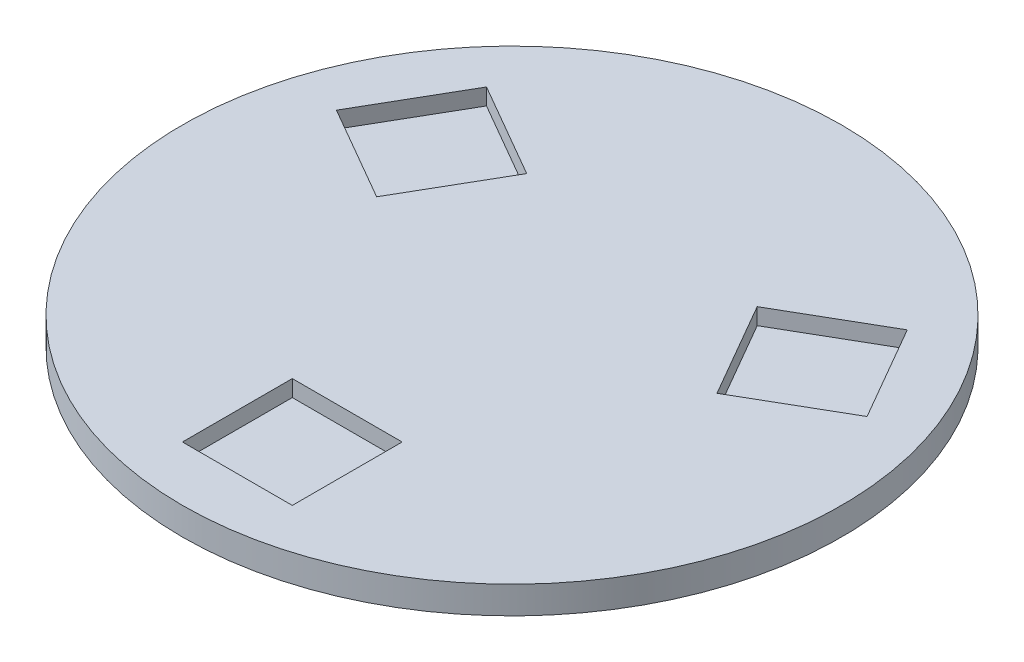
ISO-10303-21;
HEADER;
FILE_DESCRIPTION(('STEP AP214'),'2;1');
FILE_NAME('part.step','',(''),(''),'','','');
FILE_SCHEMA(('AUTOMOTIVE_DESIGN { 1 0 10303 214 1 1 1 1 }'));
ENDSEC;
DATA;
#1=APPLICATION_CONTEXT('core data for automotive mechanical design processes');
#2=APPLICATION_PROTOCOL_DEFINITION('international standard','automotive_design',2000,#1);
#3=PRODUCT_CONTEXT('',#1,'mechanical');
#4=PRODUCT('Part','Part','',(#3));
#5=PRODUCT_RELATED_PRODUCT_CATEGORY('part','',(#4));
#6=PRODUCT_DEFINITION_FORMATION('','',#4);
#7=PRODUCT_DEFINITION_CONTEXT('part definition',#1,'design');
#8=PRODUCT_DEFINITION('design','',#6,#7);
#9=PRODUCT_DEFINITION_SHAPE('','',#8);
#10=(LENGTH_UNIT() NAMED_UNIT(*) SI_UNIT(.MILLI.,.METRE.));
#11=(NAMED_UNIT(*) PLANE_ANGLE_UNIT() SI_UNIT($,.RADIAN.));
#12=(NAMED_UNIT(*) SI_UNIT($,.STERADIAN.) SOLID_ANGLE_UNIT());
#13=UNCERTAINTY_MEASURE_WITH_UNIT(LENGTH_MEASURE(1.E-05),#10,'distance_accuracy_value','');
#14=(GEOMETRIC_REPRESENTATION_CONTEXT(3) GLOBAL_UNCERTAINTY_ASSIGNED_CONTEXT((#13)) GLOBAL_UNIT_ASSIGNED_CONTEXT((#10,
#11,#12)) REPRESENTATION_CONTEXT('',''));
#15=CARTESIAN_POINT('',(0.,0.,0.));
#16=DIRECTION('',(0.,0.,1.));
#17=DIRECTION('',(1.,0.,0.));
#18=AXIS2_PLACEMENT_3D('',#15,#16,#17);
#19=CARTESIAN_POINT('',(0.,250.,0.));
#20=DIRECTION('',(0.,-1.,0.));
#21=DIRECTION('',(0.,0.,-1.));
#22=AXIS2_PLACEMENT_3D('',#19,#20,#21);
#23=CYLINDRICAL_SURFACE('',#22,3000.);
#24=CARTESIAN_POINT('',(0.,250.,0.));
#25=DIRECTION('',(0.,1.,0.));
#26=DIRECTION('',(0.,0.,1.));
#27=AXIS2_PLACEMENT_3D('',#24,#25,#26);
#28=CIRCLE('',#27,3000.);
#29=CARTESIAN_POINT('',(0.,250.,3000.));
#30=VERTEX_POINT('',#29);
#31=EDGE_CURVE('E11',#30,#30,#28,.T.);
#32=ORIENTED_EDGE('',*,*,#31,.F.);
#33=EDGE_LOOP('',(#32));
#34=FACE_BOUND('',#33,.T.);
#35=CARTESIAN_POINT('',(0.,0.,0.));
#36=DIRECTION('',(0.,1.,0.));
#37=DIRECTION('',(0.,0.,1.));
#38=AXIS2_PLACEMENT_3D('',#35,#36,#37);
#39=CIRCLE('',#38,3000.);
#40=CARTESIAN_POINT('',(0.,0.,3000.));
#41=VERTEX_POINT('',#40);
#42=EDGE_CURVE('E47',#41,#41,#39,.T.);
#43=ORIENTED_EDGE('',*,*,#42,.T.);
#44=EDGE_LOOP('',(#43));
#45=FACE_BOUND('',#44,.T.);
#46=ADVANCED_FACE('F44',(#34,#45),#23,.T.);
#47=CARTESIAN_POINT('',(0.,250.,0.));
#48=DIRECTION('',(0.,1.,0.));
#49=DIRECTION('',(0.,0.,1.));
#50=AXIS2_PLACEMENT_3D('',#47,#48,#49);
#51=PLANE('',#50);
#52=DIRECTION('',(0.866025403784436,0.,-0.500000000000004));
#53=VECTOR('',#52,1.);
#54=CARTESIAN_POINT('',(1549.03810567666,250.,-316.987298107788));
#55=LINE('',#54,#53);
#56=CARTESIAN_POINT('',(1549.03810567666,250.,-316.987298107788));
#57=VERTEX_POINT('',#56);
#58=CARTESIAN_POINT('',(2415.06350946109,250.,-816.987298107792));
#59=VERTEX_POINT('',#58);
#60=EDGE_CURVE('E59',#57,#59,#55,.T.);
#61=ORIENTED_EDGE('',*,*,#60,.F.);
#62=DIRECTION('',(0.500000000000004,0.,0.866025403784436));
#63=VECTOR('',#62,1.);
#64=CARTESIAN_POINT('',(1049.03810567665,250.,-1183.01270189222));
#65=LINE('',#64,#63);
#66=CARTESIAN_POINT('',(1049.03810567665,250.,-1183.01270189222));
#67=VERTEX_POINT('',#66);
#68=EDGE_CURVE('E156',#67,#57,#65,.T.);
#69=ORIENTED_EDGE('',*,*,#68,.F.);
#70=DIRECTION('',(-0.866025403784436,0.,0.500000000000004));
#71=VECTOR('',#70,1.);
#72=CARTESIAN_POINT('',(1049.03810567665,250.,-1183.01270189222));
#73=LINE('',#72,#71);
#74=CARTESIAN_POINT('',(1915.06350946109,250.,-1683.01270189223));
#75=VERTEX_POINT('',#74);
#76=EDGE_CURVE('E160',#75,#67,#73,.T.);
#77=ORIENTED_EDGE('',*,*,#76,.F.);
#78=DIRECTION('',(-0.500000000000004,0.,-0.866025403784436));
#79=VECTOR('',#78,1.);
#80=CARTESIAN_POINT('',(1915.06350946109,250.,-1683.01270189223));
#81=LINE('',#80,#79);
#82=EDGE_CURVE('E169',#59,#75,#81,.T.);
#83=ORIENTED_EDGE('',*,*,#82,.F.);
#84=EDGE_LOOP('',(#61,#69,#77,#83));
#85=FACE_BOUND('',#84,.T.);
#86=DIRECTION('',(-0.866025403784443,0.,-0.499999999999992));
#87=VECTOR('',#86,1.);
#88=CARTESIAN_POINT('',(-1049.03810567667,250.,-1183.01270189221));
#89=LINE('',#88,#87);
#90=CARTESIAN_POINT('',(-1049.03810567667,250.,-1183.01270189221));
#91=VERTEX_POINT('',#90);
#92=CARTESIAN_POINT('',(-1915.06350946111,250.,-1683.0127018922));
#93=VERTEX_POINT('',#92);
#94=EDGE_CURVE('E67',#91,#93,#89,.T.);
#95=ORIENTED_EDGE('',*,*,#94,.F.);
#96=DIRECTION('',(0.499999999999992,0.,-0.866025403784443));
#97=VECTOR('',#96,1.);
#98=CARTESIAN_POINT('',(-1549.03810567666,250.,-316.987298107766));
#99=LINE('',#98,#97);
#100=CARTESIAN_POINT('',(-1549.03810567666,250.,-316.987298107766));
#101=VERTEX_POINT('',#100);
#102=EDGE_CURVE('E190',#101,#91,#99,.T.);
#103=ORIENTED_EDGE('',*,*,#102,.F.);
#104=DIRECTION('',(0.866025403784443,0.,0.499999999999992));
#105=VECTOR('',#104,1.);
#106=CARTESIAN_POINT('',(-1549.03810567666,250.,-316.987298107766));
#107=LINE('',#106,#105);
#108=CARTESIAN_POINT('',(-2415.0635094611,250.,-816.987298107758));
#109=VERTEX_POINT('',#108);
#110=EDGE_CURVE('E209',#109,#101,#107,.T.);
#111=ORIENTED_EDGE('',*,*,#110,.F.);
#112=DIRECTION('',(-0.499999999999992,0.,0.866025403784443));
#113=VECTOR('',#112,1.);
#114=CARTESIAN_POINT('',(-2415.0635094611,250.,-816.987298107758));
#115=LINE('',#114,#113);
#116=EDGE_CURVE('E205',#93,#109,#115,.T.);
#117=ORIENTED_EDGE('',*,*,#116,.F.);
#118=EDGE_LOOP('',(#95,#103,#111,#117));
#119=FACE_BOUND('',#118,.T.);
#120=DIRECTION('',(0.,0.,1.));
#121=VECTOR('',#120,1.);
#122=CARTESIAN_POINT('',(-500.,250.,1500.));
#123=LINE('',#122,#121);
#124=CARTESIAN_POINT('',(-500.,250.,1500.));
#125=VERTEX_POINT('',#124);
#126=CARTESIAN_POINT('',(-499.999999999999,250.,2500.));
#127=VERTEX_POINT('',#126);
#128=EDGE_CURVE('E179',#125,#127,#123,.T.);
#129=ORIENTED_EDGE('',*,*,#128,.F.);
#130=DIRECTION('',(-1.,0.,0.));
#131=VECTOR('',#130,1.);
#132=CARTESIAN_POINT('',(500.,250.,1500.));
#133=LINE('',#132,#131);
#134=CARTESIAN_POINT('',(500.,250.,1500.));
#135=VERTEX_POINT('',#134);
#136=EDGE_CURVE('E231',#135,#125,#133,.T.);
#137=ORIENTED_EDGE('',*,*,#136,.F.);
#138=DIRECTION('',(0.,0.,-1.));
#139=VECTOR('',#138,1.);
#140=CARTESIAN_POINT('',(500.,250.,1500.));
#141=LINE('',#140,#139);
#142=CARTESIAN_POINT('',(500.,250.,2500.));
#143=VERTEX_POINT('',#142);
#144=EDGE_CURVE('E250',#143,#135,#141,.T.);
#145=ORIENTED_EDGE('',*,*,#144,.F.);
#146=DIRECTION('',(1.,0.,0.));
#147=VECTOR('',#146,1.);
#148=CARTESIAN_POINT('',(500.,250.,2500.));
#149=LINE('',#148,#147);
#150=EDGE_CURVE('E246',#127,#143,#149,.T.);
#151=ORIENTED_EDGE('',*,*,#150,.F.);
#152=EDGE_LOOP('',(#129,#137,#145,#151));
#153=FACE_BOUND('',#152,.T.);
#154=ORIENTED_EDGE('',*,*,#31,.T.);
#155=EDGE_LOOP('',(#154));
#156=FACE_BOUND('',#155,.T.);
#157=ADVANCED_FACE('F277',(#85,#119,#153,#156),#51,.T.);
#158=CARTESIAN_POINT('',(0.,0.,0.));
#159=DIRECTION('',(0.,1.,0.));
#160=DIRECTION('',(0.,0.,1.));
#161=AXIS2_PLACEMENT_3D('',#158,#159,#160);
#162=PLANE('',#161);
#163=ORIENTED_EDGE('',*,*,#42,.F.);
#164=EDGE_LOOP('',(#163));
#165=FACE_BOUND('',#164,.T.);
#166=ADVANCED_FACE('F296',(#165),#162,.F.);
#167=CARTESIAN_POINT('',(-500.,100.,1500.));
#168=DIRECTION('',(-1.,0.,0.));
#169=DIRECTION('',(0.,0.,1.));
#170=AXIS2_PLACEMENT_3D('',#167,#168,#169);
#171=PLANE('',#170);
#172=ORIENTED_EDGE('',*,*,#128,.T.);
#173=DIRECTION('',(0.,1.,0.));
#174=VECTOR('',#173,1.);
#175=CARTESIAN_POINT('',(-499.999999999999,100.,2500.));
#176=LINE('',#175,#174);
#177=CARTESIAN_POINT('',(-499.999999999999,100.,2500.));
#178=VERTEX_POINT('',#177);
#179=EDGE_CURVE('E243',#178,#127,#176,.T.);
#180=ORIENTED_EDGE('',*,*,#179,.F.);
#181=DIRECTION('',(0.,0.,1.));
#182=VECTOR('',#181,1.);
#183=CARTESIAN_POINT('',(-500.,100.,1500.));
#184=LINE('',#183,#182);
#185=CARTESIAN_POINT('',(-500.,100.,1500.));
#186=VERTEX_POINT('',#185);
#187=EDGE_CURVE('E226',#186,#178,#184,.T.);
#188=ORIENTED_EDGE('',*,*,#187,.F.);
#189=DIRECTION('',(0.,1.,0.));
#190=VECTOR('',#189,1.);
#191=CARTESIAN_POINT('',(-500.,100.,1500.));
#192=LINE('',#191,#190);
#193=EDGE_CURVE('E257',#186,#125,#192,.T.);
#194=ORIENTED_EDGE('',*,*,#193,.T.);
#195=EDGE_LOOP('',(#172,#180,#188,#194));
#196=FACE_BOUND('',#195,.T.);
#197=ADVANCED_FACE('F286',(#196),#171,.F.);
#198=CARTESIAN_POINT('',(500.,100.,1500.));
#199=DIRECTION('',(0.,0.,-1.));
#200=DIRECTION('',(-1.,0.,0.));
#201=AXIS2_PLACEMENT_3D('',#198,#199,#200);
#202=PLANE('',#201);
#203=ORIENTED_EDGE('',*,*,#136,.T.);
#204=ORIENTED_EDGE('',*,*,#193,.F.);
#205=DIRECTION('',(-1.,0.,0.));
#206=VECTOR('',#205,1.);
#207=CARTESIAN_POINT('',(500.,100.,1500.));
#208=LINE('',#207,#206);
#209=CARTESIAN_POINT('',(500.,100.,1500.));
#210=VERTEX_POINT('',#209);
#211=EDGE_CURVE('E239',#210,#186,#208,.T.);
#212=ORIENTED_EDGE('',*,*,#211,.F.);
#213=DIRECTION('',(0.,1.,0.));
#214=VECTOR('',#213,1.);
#215=CARTESIAN_POINT('',(500.,100.,1500.));
#216=LINE('',#215,#214);
#217=EDGE_CURVE('E260',#210,#135,#216,.T.);
#218=ORIENTED_EDGE('',*,*,#217,.T.);
#219=EDGE_LOOP('',(#203,#204,#212,#218));
#220=FACE_BOUND('',#219,.T.);
#221=ADVANCED_FACE('F288',(#220),#202,.F.);
#222=CARTESIAN_POINT('',(500.,100.,1500.));
#223=DIRECTION('',(1.,0.,0.));
#224=DIRECTION('',(0.,0.,-1.));
#225=AXIS2_PLACEMENT_3D('',#222,#223,#224);
#226=PLANE('',#225);
#227=ORIENTED_EDGE('',*,*,#144,.T.);
#228=ORIENTED_EDGE('',*,*,#217,.F.);
#229=DIRECTION('',(0.,0.,-1.));
#230=VECTOR('',#229,1.);
#231=CARTESIAN_POINT('',(500.,100.,1500.));
#232=LINE('',#231,#230);
#233=CARTESIAN_POINT('',(500.,100.,2500.));
#234=VERTEX_POINT('',#233);
#235=EDGE_CURVE('E235',#234,#210,#232,.T.);
#236=ORIENTED_EDGE('',*,*,#235,.F.);
#237=DIRECTION('',(0.,1.,0.));
#238=VECTOR('',#237,1.);
#239=CARTESIAN_POINT('',(500.,100.,2500.));
#240=LINE('',#239,#238);
#241=EDGE_CURVE('E263',#234,#143,#240,.T.);
#242=ORIENTED_EDGE('',*,*,#241,.T.);
#243=EDGE_LOOP('',(#227,#228,#236,#242));
#244=FACE_BOUND('',#243,.T.);
#245=ADVANCED_FACE('F281',(#244),#226,.F.);
#246=CARTESIAN_POINT('',(500.,100.,2500.));
#247=DIRECTION('',(0.,0.,1.));
#248=DIRECTION('',(1.,0.,0.));
#249=AXIS2_PLACEMENT_3D('',#246,#247,#248);
#250=PLANE('',#249);
#251=ORIENTED_EDGE('',*,*,#150,.T.);
#252=ORIENTED_EDGE('',*,*,#241,.F.);
#253=DIRECTION('',(1.,0.,0.));
#254=VECTOR('',#253,1.);
#255=CARTESIAN_POINT('',(500.,100.,2500.));
#256=LINE('',#255,#254);
#257=EDGE_CURVE('E230',#178,#234,#256,.T.);
#258=ORIENTED_EDGE('',*,*,#257,.F.);
#259=ORIENTED_EDGE('',*,*,#179,.T.);
#260=EDGE_LOOP('',(#251,#252,#258,#259));
#261=FACE_BOUND('',#260,.T.);
#262=ADVANCED_FACE('F271',(#261),#250,.F.);
#263=CARTESIAN_POINT('',(0.,100.,0.));
#264=DIRECTION('',(0.,-1.,0.));
#265=DIRECTION('',(0.,0.,-1.));
#266=AXIS2_PLACEMENT_3D('',#263,#264,#265);
#267=PLANE('',#266);
#268=ORIENTED_EDGE('',*,*,#187,.T.);
#269=ORIENTED_EDGE('',*,*,#257,.T.);
#270=ORIENTED_EDGE('',*,*,#235,.T.);
#271=ORIENTED_EDGE('',*,*,#211,.T.);
#272=EDGE_LOOP('',(#268,#269,#270,#271));
#273=FACE_BOUND('',#272,.T.);
#274=ADVANCED_FACE('F285',(#273),#267,.F.);
#275=CARTESIAN_POINT('',(-1049.03810567667,100.,-1183.01270189221));
#276=DIRECTION('',(0.499999999999992,0.,-0.866025403784443));
#277=DIRECTION('',(-0.866025403784443,0.,-0.499999999999992));
#278=AXIS2_PLACEMENT_3D('',#275,#276,#277);
#279=PLANE('',#278);
#280=ORIENTED_EDGE('',*,*,#94,.T.);
#281=DIRECTION('',(0.,1.,0.));
#282=VECTOR('',#281,1.);
#283=CARTESIAN_POINT('',(-1915.06350946111,100.,-1683.0127018922));
#284=LINE('',#283,#282);
#285=CARTESIAN_POINT('',(-1915.06350946111,100.,-1683.0127018922));
#286=VERTEX_POINT('',#285);
#287=EDGE_CURVE('E202',#286,#93,#284,.T.);
#288=ORIENTED_EDGE('',*,*,#287,.F.);
#289=DIRECTION('',(-0.866025403784443,0.,-0.499999999999992));
#290=VECTOR('',#289,1.);
#291=CARTESIAN_POINT('',(-1049.03810567667,100.,-1183.01270189221));
#292=LINE('',#291,#290);
#293=CARTESIAN_POINT('',(-1049.03810567667,100.,-1183.01270189221));
#294=VERTEX_POINT('',#293);
#295=EDGE_CURVE('E185',#294,#286,#292,.T.);
#296=ORIENTED_EDGE('',*,*,#295,.F.);
#297=DIRECTION('',(0.,1.,0.));
#298=VECTOR('',#297,1.);
#299=CARTESIAN_POINT('',(-1049.03810567667,100.,-1183.01270189221));
#300=LINE('',#299,#298);
#301=EDGE_CURVE('E170',#294,#91,#300,.T.);
#302=ORIENTED_EDGE('',*,*,#301,.T.);
#303=EDGE_LOOP('',(#280,#288,#296,#302));
#304=FACE_BOUND('',#303,.T.);
#305=ADVANCED_FACE('F320',(#304),#279,.F.);
#306=CARTESIAN_POINT('',(-1549.03810567666,100.,-316.987298107766));
#307=DIRECTION('',(0.866025403784443,0.,0.499999999999992));
#308=DIRECTION('',(0.499999999999992,0.,-0.866025403784443));
#309=AXIS2_PLACEMENT_3D('',#306,#307,#308);
#310=PLANE('',#309);
#311=ORIENTED_EDGE('',*,*,#102,.T.);
#312=ORIENTED_EDGE('',*,*,#301,.F.);
#313=DIRECTION('',(0.499999999999992,0.,-0.866025403784443));
#314=VECTOR('',#313,1.);
#315=CARTESIAN_POINT('',(-1549.03810567666,100.,-316.987298107766));
#316=LINE('',#315,#314);
#317=CARTESIAN_POINT('',(-1549.03810567666,100.,-316.987298107766));
#318=VERTEX_POINT('',#317);
#319=EDGE_CURVE('E198',#318,#294,#316,.T.);
#320=ORIENTED_EDGE('',*,*,#319,.F.);
#321=DIRECTION('',(0.,1.,0.));
#322=VECTOR('',#321,1.);
#323=CARTESIAN_POINT('',(-1549.03810567666,100.,-316.987298107766));
#324=LINE('',#323,#322);
#325=EDGE_CURVE('E218',#318,#101,#324,.T.);
#326=ORIENTED_EDGE('',*,*,#325,.T.);
#327=EDGE_LOOP('',(#311,#312,#320,#326));
#328=FACE_BOUND('',#327,.T.);
#329=ADVANCED_FACE('F324',(#328),#310,.F.);
#330=CARTESIAN_POINT('',(-1549.03810567666,100.,-316.987298107766));
#331=DIRECTION('',(-0.499999999999992,0.,0.866025403784443));
#332=DIRECTION('',(0.866025403784443,0.,0.499999999999992));
#333=AXIS2_PLACEMENT_3D('',#330,#331,#332);
#334=PLANE('',#333);
#335=ORIENTED_EDGE('',*,*,#110,.T.);
#336=ORIENTED_EDGE('',*,*,#325,.F.);
#337=DIRECTION('',(0.866025403784443,0.,0.499999999999992));
#338=VECTOR('',#337,1.);
#339=CARTESIAN_POINT('',(-1549.03810567666,100.,-316.987298107766));
#340=LINE('',#339,#338);
#341=CARTESIAN_POINT('',(-2415.0635094611,100.,-816.987298107758));
#342=VERTEX_POINT('',#341);
#343=EDGE_CURVE('E194',#342,#318,#340,.T.);
#344=ORIENTED_EDGE('',*,*,#343,.F.);
#345=DIRECTION('',(0.,1.,0.));
#346=VECTOR('',#345,1.);
#347=CARTESIAN_POINT('',(-2415.0635094611,100.,-816.987298107758));
#348=LINE('',#347,#346);
#349=EDGE_CURVE('E221',#342,#109,#348,.T.);
#350=ORIENTED_EDGE('',*,*,#349,.T.);
#351=EDGE_LOOP('',(#335,#336,#344,#350));
#352=FACE_BOUND('',#351,.T.);
#353=ADVANCED_FACE('F331',(#352),#334,.F.);
#354=CARTESIAN_POINT('',(-2415.0635094611,100.,-816.987298107758));
#355=DIRECTION('',(-0.866025403784443,0.,-0.499999999999992));
#356=DIRECTION('',(-0.499999999999992,0.,0.866025403784443));
#357=AXIS2_PLACEMENT_3D('',#354,#355,#356);
#358=PLANE('',#357);
#359=ORIENTED_EDGE('',*,*,#116,.T.);
#360=ORIENTED_EDGE('',*,*,#349,.F.);
#361=DIRECTION('',(-0.499999999999992,0.,0.866025403784443));
#362=VECTOR('',#361,1.);
#363=CARTESIAN_POINT('',(-2415.0635094611,100.,-816.987298107758));
#364=LINE('',#363,#362);
#365=EDGE_CURVE('E189',#286,#342,#364,.T.);
#366=ORIENTED_EDGE('',*,*,#365,.F.);
#367=ORIENTED_EDGE('',*,*,#287,.T.);
#368=EDGE_LOOP('',(#359,#360,#366,#367));
#369=FACE_BOUND('',#368,.T.);
#370=ADVANCED_FACE('F327',(#369),#358,.F.);
#371=CARTESIAN_POINT('',(0.,100.,0.));
#372=DIRECTION('',(0.,-1.,0.));
#373=DIRECTION('',(0.866025403784443,0.,0.499999999999992));
#374=AXIS2_PLACEMENT_3D('',#371,#372,#373);
#375=PLANE('',#374);
#376=ORIENTED_EDGE('',*,*,#295,.T.);
#377=ORIENTED_EDGE('',*,*,#365,.T.);
#378=ORIENTED_EDGE('',*,*,#343,.T.);
#379=ORIENTED_EDGE('',*,*,#319,.T.);
#380=EDGE_LOOP('',(#376,#377,#378,#379));
#381=FACE_BOUND('',#380,.T.);
#382=ADVANCED_FACE('F330',(#381),#375,.F.);
#383=CARTESIAN_POINT('',(1549.03810567666,100.,-316.987298107788));
#384=DIRECTION('',(0.500000000000004,0.,0.866025403784436));
#385=DIRECTION('',(0.866025403784436,0.,-0.500000000000004));
#386=AXIS2_PLACEMENT_3D('',#383,#384,#385);
#387=PLANE('',#386);
#388=ORIENTED_EDGE('',*,*,#60,.T.);
#389=DIRECTION('',(0.,1.,0.));
#390=VECTOR('',#389,1.);
#391=CARTESIAN_POINT('',(2415.06350946109,100.,-816.987298107792));
#392=LINE('',#391,#390);
#393=CARTESIAN_POINT('',(2415.06350946109,100.,-816.987298107792));
#394=VERTEX_POINT('',#393);
#395=EDGE_CURVE('E131',#394,#59,#392,.T.);
#396=ORIENTED_EDGE('',*,*,#395,.F.);
#397=DIRECTION('',(0.866025403784436,0.,-0.500000000000004));
#398=VECTOR('',#397,1.);
#399=CARTESIAN_POINT('',(1549.03810567666,100.,-316.987298107788));
#400=LINE('',#399,#398);
#401=CARTESIAN_POINT('',(1549.03810567666,100.,-316.987298107788));
#402=VERTEX_POINT('',#401);
#403=EDGE_CURVE('E135',#402,#394,#400,.T.);
#404=ORIENTED_EDGE('',*,*,#403,.F.);
#405=DIRECTION('',(0.,1.,0.));
#406=VECTOR('',#405,1.);
#407=CARTESIAN_POINT('',(1549.03810567666,100.,-316.987298107788));
#408=LINE('',#407,#406);
#409=EDGE_CURVE('E176',#402,#57,#408,.T.);
#410=ORIENTED_EDGE('',*,*,#409,.T.);
#411=EDGE_LOOP('',(#388,#396,#404,#410));
#412=FACE_BOUND('',#411,.T.);
#413=ADVANCED_FACE('F133',(#412),#387,.F.);
#414=CARTESIAN_POINT('',(1049.03810567665,100.,-1183.01270189222));
#415=DIRECTION('',(-0.866025403784436,0.,0.500000000000004));
#416=DIRECTION('',(0.500000000000004,0.,0.866025403784436));
#417=AXIS2_PLACEMENT_3D('',#414,#415,#416);
#418=PLANE('',#417);
#419=ORIENTED_EDGE('',*,*,#68,.T.);
#420=ORIENTED_EDGE('',*,*,#409,.F.);
#421=DIRECTION('',(0.500000000000004,0.,0.866025403784436));
#422=VECTOR('',#421,1.);
#423=CARTESIAN_POINT('',(1049.03810567665,100.,-1183.01270189222));
#424=LINE('',#423,#422);
#425=CARTESIAN_POINT('',(1049.03810567665,100.,-1183.01270189222));
#426=VERTEX_POINT('',#425);
#427=EDGE_CURVE('E142',#426,#402,#424,.T.);
#428=ORIENTED_EDGE('',*,*,#427,.F.);
#429=DIRECTION('',(0.,1.,0.));
#430=VECTOR('',#429,1.);
#431=CARTESIAN_POINT('',(1049.03810567665,100.,-1183.01270189222));
#432=LINE('',#431,#430);
#433=EDGE_CURVE('E180',#426,#67,#432,.T.);
#434=ORIENTED_EDGE('',*,*,#433,.T.);
#435=EDGE_LOOP('',(#419,#420,#428,#434));
#436=FACE_BOUND('',#435,.T.);
#437=ADVANCED_FACE('F344',(#436),#418,.F.);
#438=CARTESIAN_POINT('',(1049.03810567665,100.,-1183.01270189222));
#439=DIRECTION('',(-0.500000000000004,0.,-0.866025403784436));
#440=DIRECTION('',(-0.866025403784436,0.,0.500000000000004));
#441=AXIS2_PLACEMENT_3D('',#438,#439,#440);
#442=PLANE('',#441);
#443=ORIENTED_EDGE('',*,*,#76,.T.);
#444=ORIENTED_EDGE('',*,*,#433,.F.);
#445=DIRECTION('',(-0.866025403784436,0.,0.500000000000004));
#446=VECTOR('',#445,1.);
#447=CARTESIAN_POINT('',(1049.03810567665,100.,-1183.01270189222));
#448=LINE('',#447,#446);
#449=CARTESIAN_POINT('',(1915.06350946109,100.,-1683.01270189223));
#450=VERTEX_POINT('',#449);
#451=EDGE_CURVE('E151',#450,#426,#448,.T.);
#452=ORIENTED_EDGE('',*,*,#451,.F.);
#453=DIRECTION('',(0.,1.,0.));
#454=VECTOR('',#453,1.);
#455=CARTESIAN_POINT('',(1915.06350946109,100.,-1683.01270189223));
#456=LINE('',#455,#454);
#457=EDGE_CURVE('E141',#450,#75,#456,.T.);
#458=ORIENTED_EDGE('',*,*,#457,.T.);
#459=EDGE_LOOP('',(#443,#444,#452,#458));
#460=FACE_BOUND('',#459,.T.);
#461=ADVANCED_FACE('F347',(#460),#442,.F.);
#462=CARTESIAN_POINT('',(1915.06350946109,100.,-1683.01270189223));
#463=DIRECTION('',(0.866025403784436,0.,-0.500000000000004));
#464=DIRECTION('',(-0.500000000000004,0.,-0.866025403784436));
#465=AXIS2_PLACEMENT_3D('',#462,#463,#464);
#466=PLANE('',#465);
#467=ORIENTED_EDGE('',*,*,#82,.T.);
#468=ORIENTED_EDGE('',*,*,#457,.F.);
#469=DIRECTION('',(-0.500000000000004,0.,-0.866025403784436));
#470=VECTOR('',#469,1.);
#471=CARTESIAN_POINT('',(1915.06350946109,100.,-1683.01270189223));
#472=LINE('',#471,#470);
#473=EDGE_CURVE('E145',#394,#450,#472,.T.);
#474=ORIENTED_EDGE('',*,*,#473,.F.);
#475=ORIENTED_EDGE('',*,*,#395,.T.);
#476=EDGE_LOOP('',(#467,#468,#474,#475));
#477=FACE_BOUND('',#476,.T.);
#478=ADVANCED_FACE('F146',(#477),#466,.F.);
#479=CARTESIAN_POINT('',(0.,100.,0.));
#480=DIRECTION('',(0.,-1.,0.));
#481=DIRECTION('',(-0.866025403784436,0.,0.500000000000004));
#482=AXIS2_PLACEMENT_3D('',#479,#480,#481);
#483=PLANE('',#482);
#484=ORIENTED_EDGE('',*,*,#403,.T.);
#485=ORIENTED_EDGE('',*,*,#473,.T.);
#486=ORIENTED_EDGE('',*,*,#451,.T.);
#487=ORIENTED_EDGE('',*,*,#427,.T.);
#488=EDGE_LOOP('',(#484,#485,#486,#487));
#489=FACE_BOUND('',#488,.T.);
#490=ADVANCED_FACE('F153',(#489),#483,.F.);
#491=CLOSED_SHELL('',(#46,#157,#166,#197,#221,#245,#262,#274,#305,#329,#353,#370,#382,#413,#437,
#461,#478,#490));
#492=MANIFOLD_SOLID_BREP('B2',#491);
#493=ADVANCED_BREP_SHAPE_REPRESENTATION('',(#18,#492),#14);
#494=SHAPE_DEFINITION_REPRESENTATION(#9,#493);
ENDSEC;
END-ISO-10303-21;
